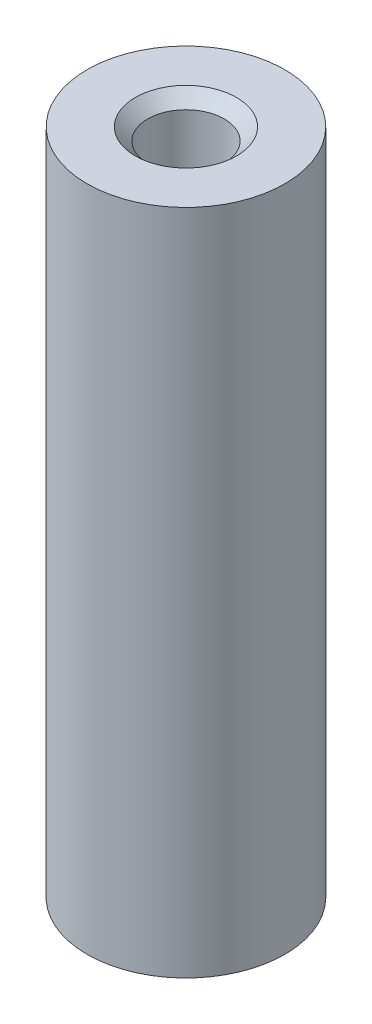
ISO-10303-21;
HEADER;
FILE_DESCRIPTION(('STEP AP214'),'2;1');
FILE_NAME('part.step','',(''),(''),'','','');
FILE_SCHEMA(('AUTOMOTIVE_DESIGN { 1 0 10303 214 1 1 1 1 }'));
ENDSEC;
DATA;
#1=APPLICATION_CONTEXT('core data for automotive mechanical design processes');
#2=APPLICATION_PROTOCOL_DEFINITION('international standard','automotive_design',2000,#1);
#3=PRODUCT_CONTEXT('',#1,'mechanical');
#4=PRODUCT('Part','Part','',(#3));
#5=PRODUCT_RELATED_PRODUCT_CATEGORY('part','',(#4));
#6=PRODUCT_DEFINITION_FORMATION('','',#4);
#7=PRODUCT_DEFINITION_CONTEXT('part definition',#1,'design');
#8=PRODUCT_DEFINITION('design','',#6,#7);
#9=PRODUCT_DEFINITION_SHAPE('','',#8);
#10=(LENGTH_UNIT() NAMED_UNIT(*) SI_UNIT(.MILLI.,.METRE.));
#11=(NAMED_UNIT(*) PLANE_ANGLE_UNIT() SI_UNIT($,.RADIAN.));
#12=(NAMED_UNIT(*) SI_UNIT($,.STERADIAN.) SOLID_ANGLE_UNIT());
#13=UNCERTAINTY_MEASURE_WITH_UNIT(LENGTH_MEASURE(1.E-05),#10,'distance_accuracy_value','');
#14=(GEOMETRIC_REPRESENTATION_CONTEXT(3) GLOBAL_UNCERTAINTY_ASSIGNED_CONTEXT((#13)) GLOBAL_UNIT_ASSIGNED_CONTEXT((#10,
#11,#12)) REPRESENTATION_CONTEXT('',''));
#15=CARTESIAN_POINT('',(0.,0.,0.));
#16=DIRECTION('',(0.,0.,1.));
#17=DIRECTION('',(1.,0.,0.));
#18=AXIS2_PLACEMENT_3D('',#15,#16,#17);
#19=CARTESIAN_POINT('',(0.,27.,0.));
#20=DIRECTION('',(0.,-1.,0.));
#21=DIRECTION('',(0.,0.,-1.));
#22=AXIS2_PLACEMENT_3D('',#19,#20,#21);
#23=CYLINDRICAL_SURFACE('',#22,4.);
#24=CARTESIAN_POINT('',(0.,27.,0.));
#25=DIRECTION('',(0.,1.,0.));
#26=DIRECTION('',(0.,0.,1.));
#27=AXIS2_PLACEMENT_3D('',#24,#25,#26);
#28=CIRCLE('',#27,4.);
#29=CARTESIAN_POINT('',(0.,27.,4.));
#30=VERTEX_POINT('',#29);
#31=EDGE_CURVE('E65',#30,#30,#28,.T.);
#32=ORIENTED_EDGE('',*,*,#31,.F.);
#33=EDGE_LOOP('',(#32));
#34=FACE_BOUND('',#33,.T.);
#35=CARTESIAN_POINT('',(0.,0.,0.));
#36=DIRECTION('',(0.,1.,0.));
#37=DIRECTION('',(0.,0.,1.));
#38=AXIS2_PLACEMENT_3D('',#35,#36,#37);
#39=CIRCLE('',#38,4.);
#40=CARTESIAN_POINT('',(0.,0.,4.));
#41=VERTEX_POINT('',#40);
#42=EDGE_CURVE('E61',#41,#41,#39,.T.);
#43=ORIENTED_EDGE('',*,*,#42,.T.);
#44=EDGE_LOOP('',(#43));
#45=FACE_BOUND('',#44,.T.);
#46=ADVANCED_FACE('F41',(#34,#45),#23,.T.);
#47=CARTESIAN_POINT('',(0.,27.,0.));
#48=DIRECTION('',(0.,1.,0.));
#49=DIRECTION('',(0.,0.,1.));
#50=AXIS2_PLACEMENT_3D('',#47,#48,#49);
#51=PLANE('',#50);
#52=CARTESIAN_POINT('',(0.,27.,0.));
#53=DIRECTION('',(0.,1.,0.));
#54=DIRECTION('',(0.,0.,1.));
#55=AXIS2_PLACEMENT_3D('',#52,#53,#54);
#56=CIRCLE('',#55,2.04999999999999);
#57=CARTESIAN_POINT('',(0.,27.,2.04999999999999));
#58=VERTEX_POINT('',#57);
#59=EDGE_CURVE('E10',#58,#58,#56,.F.);
#60=ORIENTED_EDGE('',*,*,#59,.T.);
#61=EDGE_LOOP('',(#60));
#62=FACE_BOUND('',#61,.T.);
#63=ORIENTED_EDGE('',*,*,#31,.T.);
#64=EDGE_LOOP('',(#63));
#65=FACE_BOUND('',#64,.T.);
#66=ADVANCED_FACE('F70',(#62,#65),#51,.T.);
#67=CARTESIAN_POINT('',(0.,0.,0.));
#68=DIRECTION('',(0.,1.,0.));
#69=DIRECTION('',(0.,0.,1.));
#70=AXIS2_PLACEMENT_3D('',#67,#68,#69);
#71=PLANE('',#70);
#72=CARTESIAN_POINT('',(0.,0.,0.));
#73=DIRECTION('',(0.,1.,0.));
#74=DIRECTION('',(0.,0.,1.));
#75=AXIS2_PLACEMENT_3D('',#72,#73,#74);
#76=CIRCLE('',#75,2.05);
#77=CARTESIAN_POINT('',(0.,0.,2.05));
#78=VERTEX_POINT('',#77);
#79=EDGE_CURVE('E60',#78,#78,#76,.T.);
#80=ORIENTED_EDGE('',*,*,#79,.T.);
#81=EDGE_LOOP('',(#80));
#82=FACE_BOUND('',#81,.T.);
#83=ORIENTED_EDGE('',*,*,#42,.F.);
#84=EDGE_LOOP('',(#83));
#85=FACE_BOUND('',#84,.T.);
#86=ADVANCED_FACE('F78',(#82,#85),#71,.F.);
#87=CARTESIAN_POINT('',(0.,27.,0.));
#88=DIRECTION('',(0.,1.,0.));
#89=DIRECTION('',(0.,0.,1.));
#90=AXIS2_PLACEMENT_3D('',#87,#88,#89);
#91=CYLINDRICAL_SURFACE('',#90,1.54999999999999);
#92=CARTESIAN_POINT('',(0.,0.500000000000011,0.));
#93=DIRECTION('',(0.,1.,0.));
#94=DIRECTION('',(0.,0.,1.));
#95=AXIS2_PLACEMENT_3D('',#92,#93,#94);
#96=CIRCLE('',#95,1.54999999999999);
#97=CARTESIAN_POINT('',(0.,0.500000000000011,1.54999999999999));
#98=VERTEX_POINT('',#97);
#99=EDGE_CURVE('E47',#98,#98,#96,.F.);
#100=ORIENTED_EDGE('',*,*,#99,.T.);
#101=EDGE_LOOP('',(#100));
#102=FACE_BOUND('',#101,.T.);
#103=CARTESIAN_POINT('',(0.,26.5,0.));
#104=DIRECTION('',(0.,1.,0.));
#105=DIRECTION('',(0.,0.,1.));
#106=AXIS2_PLACEMENT_3D('',#103,#104,#105);
#107=CIRCLE('',#106,1.54999999999999);
#108=CARTESIAN_POINT('',(0.,26.5,1.54999999999999));
#109=VERTEX_POINT('',#108);
#110=EDGE_CURVE('E52',#109,#109,#107,.T.);
#111=ORIENTED_EDGE('',*,*,#110,.T.);
#112=EDGE_LOOP('',(#111));
#113=FACE_BOUND('',#112,.T.);
#114=ADVANCED_FACE('F76',(#102,#113),#91,.F.);
#115=CARTESIAN_POINT('',(0.,0.,0.));
#116=DIRECTION('',(0.,-1.,0.));
#117=DIRECTION('',(0.,0.,-1.));
#118=AXIS2_PLACEMENT_3D('',#115,#116,#117);
#119=CONICAL_SURFACE('',#118,2.05,0.785398163397446);
#120=ORIENTED_EDGE('',*,*,#99,.F.);
#121=EDGE_LOOP('',(#120));
#122=FACE_BOUND('',#121,.T.);
#123=ORIENTED_EDGE('',*,*,#79,.F.);
#124=EDGE_LOOP('',(#123));
#125=FACE_BOUND('',#124,.T.);
#126=ADVANCED_FACE('F81',(#122,#125),#119,.F.);
#127=CARTESIAN_POINT('',(0.,26.5,0.));
#128=DIRECTION('',(0.,1.,0.));
#129=DIRECTION('',(0.,0.,1.));
#130=AXIS2_PLACEMENT_3D('',#127,#128,#129);
#131=CONICAL_SURFACE('',#130,1.54999999999999,0.785398163397453);
#132=ORIENTED_EDGE('',*,*,#59,.F.);
#133=EDGE_LOOP('',(#132));
#134=FACE_BOUND('',#133,.T.);
#135=ORIENTED_EDGE('',*,*,#110,.F.);
#136=EDGE_LOOP('',(#135));
#137=FACE_BOUND('',#136,.T.);
#138=ADVANCED_FACE('F42',(#134,#137),#131,.F.);
#139=CLOSED_SHELL('',(#46,#66,#86,#114,#126,#138));
#140=MANIFOLD_SOLID_BREP('B2',#139);
#141=ADVANCED_BREP_SHAPE_REPRESENTATION('',(#18,#140),#14);
#142=SHAPE_DEFINITION_REPRESENTATION(#9,#141);
ENDSEC;
END-ISO-10303-21;
